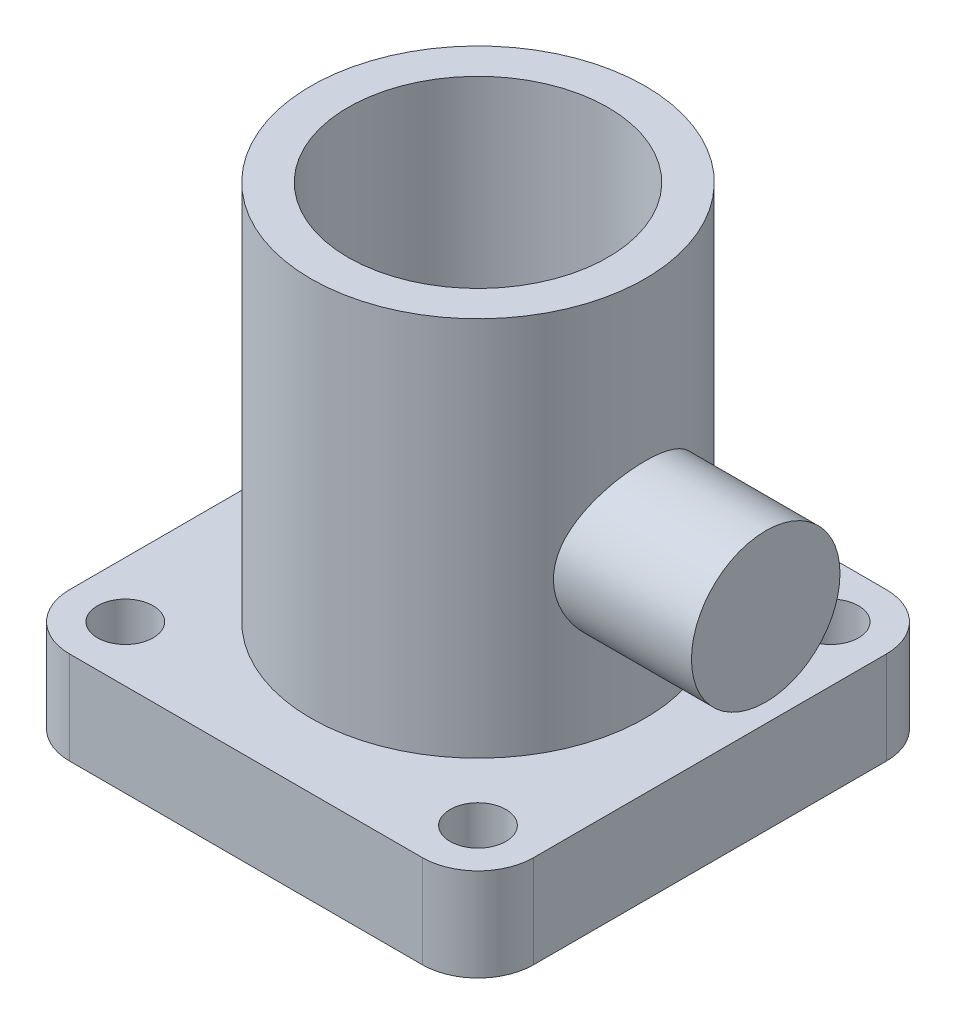
ISO-10303-21;
HEADER;
FILE_DESCRIPTION(('STEP AP214'),'2;1');
FILE_NAME('part.step','',(''),(''),'','','');
FILE_SCHEMA(('AUTOMOTIVE_DESIGN { 1 0 10303 214 1 1 1 1 }'));
ENDSEC;
DATA;
#1=APPLICATION_CONTEXT('core data for automotive mechanical design processes');
#2=APPLICATION_PROTOCOL_DEFINITION('international standard','automotive_design',2000,#1);
#3=PRODUCT_CONTEXT('',#1,'mechanical');
#4=PRODUCT('Part','Part','',(#3));
#5=PRODUCT_RELATED_PRODUCT_CATEGORY('part','',(#4));
#6=PRODUCT_DEFINITION_FORMATION('','',#4);
#7=PRODUCT_DEFINITION_CONTEXT('part definition',#1,'design');
#8=PRODUCT_DEFINITION('design','',#6,#7);
#9=PRODUCT_DEFINITION_SHAPE('','',#8);
#10=(LENGTH_UNIT() NAMED_UNIT(*) SI_UNIT(.MILLI.,.METRE.));
#11=(NAMED_UNIT(*) PLANE_ANGLE_UNIT() SI_UNIT($,.RADIAN.));
#12=(NAMED_UNIT(*) SI_UNIT($,.STERADIAN.) SOLID_ANGLE_UNIT());
#13=UNCERTAINTY_MEASURE_WITH_UNIT(LENGTH_MEASURE(1.E-05),#10,'distance_accuracy_value','');
#14=(GEOMETRIC_REPRESENTATION_CONTEXT(3) GLOBAL_UNCERTAINTY_ASSIGNED_CONTEXT((#13)) GLOBAL_UNIT_ASSIGNED_CONTEXT((#10,
#11,#12)) REPRESENTATION_CONTEXT('',''));
#15=CARTESIAN_POINT('',(0.,0.,0.));
#16=DIRECTION('',(0.,0.,1.));
#17=DIRECTION('',(1.,0.,0.));
#18=AXIS2_PLACEMENT_3D('',#15,#16,#17);
#19=CARTESIAN_POINT('',(0.,51.,0.));
#20=DIRECTION('',(0.,-1.,0.));
#21=DIRECTION('',(0.,0.,-1.));
#22=AXIS2_PLACEMENT_3D('',#19,#20,#21);
#23=CYLINDRICAL_SURFACE('',#22,18.);
#24=CARTESIAN_POINT('',(0.,51.,0.));
#25=DIRECTION('',(0.,1.,0.));
#26=DIRECTION('',(0.,0.,1.));
#27=AXIS2_PLACEMENT_3D('',#24,#25,#26);
#28=CIRCLE('',#27,18.);
#29=CARTESIAN_POINT('',(0.,51.,18.));
#30=VERTEX_POINT('',#29);
#31=EDGE_CURVE('E170',#30,#30,#28,.T.);
#32=ORIENTED_EDGE('',*,*,#31,.F.);
#33=EDGE_LOOP('',(#32));
#34=FACE_BOUND('',#33,.T.);
#35=CARTESIAN_POINT('',(0.,10.,0.));
#36=DIRECTION('',(0.,-1.,0.));
#37=DIRECTION('',(0.,0.,-1.));
#38=AXIS2_PLACEMENT_3D('',#35,#36,#37);
#39=CIRCLE('',#38,18.);
#40=CARTESIAN_POINT('',(0.,10.,-18.));
#41=VERTEX_POINT('',#40);
#42=EDGE_CURVE('E50',#41,#41,#39,.F.);
#43=ORIENTED_EDGE('',*,*,#42,.T.);
#44=EDGE_LOOP('',(#43));
#45=FACE_BOUND('',#44,.T.);
#46=CARTESIAN_POINT('',(16.1245154965971,26.,8.));
#47=CARTESIAN_POINT('',(16.1245173844685,25.7880854300968,7.99999831723584));
#48=CARTESIAN_POINT('',(16.1287075710206,25.5761129175397,7.99156779414506));
#49=CARTESIAN_POINT('',(16.1453266061845,25.1537366565836,7.95793746262861));
#50=CARTESIAN_POINT('',(16.1577603573088,24.9433339170834,7.93272767540808));
#51=CARTESIAN_POINT('',(16.1904617266022,24.5253675723789,7.86576997483584));
#52=CARTESIAN_POINT('',(16.2107447194581,24.3178103722148,7.82398959985824));
#53=CARTESIAN_POINT('',(16.2584620085057,23.9073537972193,7.72434196550041));
#54=CARTESIAN_POINT('',(16.2858993425086,23.7044564409249,7.66646787185647));
#55=CARTESIAN_POINT('',(16.3468833814742,23.3057029649651,7.53555475293443));
#56=CARTESIAN_POINT('',(16.3803993264153,23.1098170839798,7.46259183317014));
#57=CARTESIAN_POINT('',(16.4526380017907,22.7250924703705,7.30194878977129));
#58=CARTESIAN_POINT('',(16.491362725522,22.5362564711155,7.21426302879007));
#59=CARTESIAN_POINT('',(16.5728994701461,22.166796595661,7.02492815140359));
#60=CARTESIAN_POINT('',(16.6157090671748,21.98616794221,6.92328730008513));
#61=CARTESIAN_POINT('',(16.7043290743674,21.6337997331962,6.70664513728595));
#62=CARTESIAN_POINT('',(16.7501405774116,21.4620634562034,6.59163894807261));
#63=CARTESIAN_POINT('',(16.8466296186917,21.117582292585,6.34115277263391));
#64=CARTESIAN_POINT('',(16.8974306119768,20.9454830833526,6.20483168139262));
#65=CARTESIAN_POINT('',(16.9997880262405,20.6131840799974,5.91864012310987));
#66=CARTESIAN_POINT('',(17.0513444742763,20.4529847133313,5.76876916976921));
#67=CARTESIAN_POINT('',(17.1539222783134,20.1452490365932,5.45619080306819));
#68=CARTESIAN_POINT('',(17.2049433056521,19.9977201458417,5.2934759744243));
#69=CARTESIAN_POINT('',(17.3051194894044,19.7163352783986,4.95618577055871));
#70=CARTESIAN_POINT('',(17.3542752786211,19.5824746380617,4.78161447487839));
#71=CARTESIAN_POINT('',(17.451944420544,19.3227567049135,4.41225085697341));
#72=CARTESIAN_POINT('',(17.5002965309104,19.1976581423861,4.21688105837181));
#73=CARTESIAN_POINT('',(17.592223783187,18.9645319877898,3.81524307030924));
#74=CARTESIAN_POINT('',(17.6358009081066,18.8564973009519,3.60897945809888));
#75=CARTESIAN_POINT('',(17.7169432898632,18.6584579183544,3.18686322089285));
#76=CARTESIAN_POINT('',(17.7545095070744,18.5684503417893,2.97101213476108));
#77=CARTESIAN_POINT('',(17.8225194812956,18.4074027061156,2.53126088316878));
#78=CARTESIAN_POINT('',(17.852963815067,18.3363611109926,2.30736137120063));
#79=CARTESIAN_POINT('',(17.904257876405,18.217638959504,1.86651849716053));
#80=CARTESIAN_POINT('',(17.9255631028507,18.1688388892102,1.64992936801691));
#81=CARTESIAN_POINT('',(17.9604311199582,18.0893511335618,1.21283479296799));
#82=CARTESIAN_POINT('',(17.9739941859878,18.0586628040196,0.992329486638335));
#83=CARTESIAN_POINT('',(17.9929834790412,18.0157765357964,0.549266332095986));
#84=CARTESIAN_POINT('',(17.9984129168231,18.0035713008738,0.326709328719164));
#85=CARTESIAN_POINT('',(18.000986079252,17.9977810038239,-0.118690285937497));
#86=CARTESIAN_POINT('',(17.9981301795248,18.0041950975668,-0.341532883811736));
#87=CARTESIAN_POINT('',(17.9847020933519,18.0344697291131,-0.770229836855616));
#88=CARTESIAN_POINT('',(17.9746788214889,18.0570893839132,-0.976190488290874));
#89=CARTESIAN_POINT('',(17.9477796781798,18.1181507550077,-1.3853715673678));
#90=CARTESIAN_POINT('',(17.9309014453193,18.1565979236665,-1.58859102576598));
#91=CARTESIAN_POINT('',(17.8907148831089,18.2489095751061,-1.99076696624121));
#92=CARTESIAN_POINT('',(17.8674087504012,18.3027687912776,-2.18972487965374));
#93=CARTESIAN_POINT('',(17.814913874302,18.425422282077,-2.58226130183552));
#94=CARTESIAN_POINT('',(17.7857228880376,18.4942222517949,-2.77583772747246));
#95=CARTESIAN_POINT('',(17.7216726940735,18.6472737173456,-3.15921637846952));
#96=CARTESIAN_POINT('',(17.6867358849264,18.7317391211582,-3.34892013533131));
#97=CARTESIAN_POINT('',(17.612310171007,18.9147716703667,-3.72054572501928));
#98=CARTESIAN_POINT('',(17.5728196098477,19.0133439501771,-3.90246469299827));
#99=CARTESIAN_POINT('',(17.4901925625269,19.2238502823383,-4.25750941286914));
#100=CARTESIAN_POINT('',(17.447056279086,19.3357835918909,-4.43063565282522));
#101=CARTESIAN_POINT('',(17.3580761944569,19.5723392890387,-4.76733985854246));
#102=CARTESIAN_POINT('',(17.3122314231476,19.6969662349307,-4.93091436085488));
#103=CARTESIAN_POINT('',(17.2151845254857,19.9684262037271,-5.26014620577745));
#104=CARTESIAN_POINT('',(17.1638442956857,20.1162343378699,-5.4249598087832));
#105=CARTESIAN_POINT('',(17.0605056347139,20.424877052991,-5.74168121901704));
#106=CARTESIAN_POINT('',(17.0085071780705,20.5857121393844,-5.89358852504236));
#107=CARTESIAN_POINT('',(16.9051693940131,20.9196483470674,-6.18376803613575));
#108=CARTESIAN_POINT('',(16.8538305336574,21.0927576491085,-6.32203099763521));
#109=CARTESIAN_POINT('',(16.753252225237,21.4501808850419,-6.58393616631743));
#110=CARTESIAN_POINT('',(16.7040120270665,21.6344907574985,-6.70758362588862));
#111=CARTESIAN_POINT('',(16.6070020506593,22.0214264355644,-6.94438947774858));
#112=CARTESIAN_POINT('',(16.5593822210479,22.2244970489115,-7.05688426159653));
#113=CARTESIAN_POINT('',(16.4695129333972,22.6405246655019,-7.26415218409368));
#114=CARTESIAN_POINT('',(16.4272611000893,22.8534772387568,-7.3589331696747));
#115=CARTESIAN_POINT('',(16.3496213055803,23.2878522416804,-7.52985387823975));
#116=CARTESIAN_POINT('',(16.3142303541259,23.5092709308633,-7.60600172612036));
#117=CARTESIAN_POINT('',(16.2516495386502,23.9590038800857,-7.73881716542491));
#118=CARTESIAN_POINT('',(16.2244588203143,24.1873174190791,-7.79548678621097));
#119=CARTESIAN_POINT('',(16.1809822825699,24.6326078032911,-7.88531040967217));
#120=CARTESIAN_POINT('',(16.1640613735819,24.8492448533888,-7.91984376057651));
#121=CARTESIAN_POINT('',(16.1388886731971,25.2851234250266,-7.97101582222543));
#122=CARTESIAN_POINT('',(16.130636464286,25.5043648206181,-7.98765539479638));
#123=CARTESIAN_POINT('',(16.1231199685624,25.9435445757133,-8.00281664233786));
#124=CARTESIAN_POINT('',(16.1238523193879,26.1634826436909,-8.00134509517347));
#125=CARTESIAN_POINT('',(16.134268851521,26.6022728407612,-7.98031997885346));
#126=CARTESIAN_POINT('',(16.1439526799922,26.8211250123144,-7.96076712240067));
#127=CARTESIAN_POINT('',(16.1708129564299,27.2390586874689,-7.90605141179141));
#128=CARTESIAN_POINT('',(16.1873501344573,27.4383572623805,-7.87221665979632));
#129=CARTESIAN_POINT('',(16.2272043533718,27.8332390820918,-7.78973268777251));
#130=CARTESIAN_POINT('',(16.2505237032065,28.0288210373941,-7.74107842226681));
#131=CARTESIAN_POINT('',(16.3032361956667,28.4149705369608,-7.62943609248794));
#132=CARTESIAN_POINT('',(16.3326282043979,28.6055390098707,-7.56645070391758));
#133=CARTESIAN_POINT('',(16.396652000303,28.9806746238518,-7.42668830283406));
#134=CARTESIAN_POINT('',(16.4312858447315,29.1652393739465,-7.34990587319376));
#135=CARTESIAN_POINT('',(16.5449440183094,29.7245108291593,-7.09233057162595));
#136=CARTESIAN_POINT('',(16.6312839817267,30.0877265020214,-6.88923170163484));
#137=CARTESIAN_POINT('',(16.8138795280454,30.7767510681996,-6.43071715646188));
#138=CARTESIAN_POINT('',(16.9101397650623,31.1025422507831,-6.17527686915352));
#139=CARTESIAN_POINT('',(17.0597302595375,31.5730881717547,-5.74384979288594));
#140=CARTESIAN_POINT('',(17.1128010645076,31.7331174995917,-5.58412874072952));
#141=CARTESIAN_POINT('',(17.2177753192135,32.0392431318755,-5.25153114631176));
#142=CARTESIAN_POINT('',(17.2696791438604,32.1853439613994,-5.07865890963663));
#143=CARTESIAN_POINT('',(17.3709727481302,32.4627690794283,-4.72058782341959));
#144=CARTESIAN_POINT('',(17.4203610743079,32.5940848770709,-4.53538198701896));
#145=CARTESIAN_POINT('',(17.5152557653374,32.8408443734614,-4.15384559946254));
#146=CARTESIAN_POINT('',(17.5607638077543,32.9562949445713,-3.9575199174804));
#147=CARTESIAN_POINT('',(17.6470640049451,33.1713779039351,-3.55306354214972));
#148=CARTESIAN_POINT('',(17.6878108023972,33.2708610731676,-3.34484366457995));
#149=CARTESIAN_POINT('',(17.7629557505932,33.4518034001761,-2.91959172938723));
#150=CARTESIAN_POINT('',(17.7973537914545,33.5332622459969,-2.7025595193221));
#151=CARTESIAN_POINT('',(17.8587679278129,33.6772280802444,-2.26140906177526));
#152=CARTESIAN_POINT('',(17.8857881728829,33.7397457241526,-2.03729487695819));
#153=CARTESIAN_POINT('',(17.9316455780454,33.8451367104649,-1.58367729933313));
#154=CARTESIAN_POINT('',(17.9504834603661,33.8880117866675,-1.35417438405501));
#155=CARTESIAN_POINT('',(17.9782671297193,33.9510262334482,-0.909716399150562));
#156=CARTESIAN_POINT('',(17.9878671551004,33.9726718243528,-0.695014576236329));
#157=CARTESIAN_POINT('',(17.9993471860939,33.9985396525114,-0.264362285110347));
#158=CARTESIAN_POINT('',(18.0012276120922,34.0027628385366,-0.0484118855336523));
#159=CARTESIAN_POINT('',(17.997217448135,33.9937382399545,0.383006037482063));
#160=CARTESIAN_POINT('',(17.9913283745967,33.9804938645901,0.598473646928929));
#161=CARTESIAN_POINT('',(17.971942933447,33.936694429073,1.02729288739305));
#162=CARTESIAN_POINT('',(17.9584466541185,33.9061395698116,1.24064454293711));
#163=CARTESIAN_POINT('',(17.9249777004703,33.8298111923434,1.65416895049554));
#164=CARTESIAN_POINT('',(17.9053211453748,33.7847781995449,1.85450476600019));
#165=CARTESIAN_POINT('',(17.8598656381032,33.6796514910869,2.25054265745566));
#166=CARTESIAN_POINT('',(17.8340645509163,33.6195525401492,2.44624309673058));
#167=CARTESIAN_POINT('',(17.7769360415322,33.4848628139897,2.83169559318191));
#168=CARTESIAN_POINT('',(17.7456100149699,33.4102756980897,3.02144913835908));
#169=CARTESIAN_POINT('',(17.678127350379,33.2471855052703,3.39406573427307));
#170=CARTESIAN_POINT('',(17.6419688702804,33.1586771194523,3.57692612317894));
#171=CARTESIAN_POINT('',(17.5638914957692,32.9640924327411,3.94287872867608));
#172=CARTESIAN_POINT('',(17.5217854585831,32.857400407374,4.12560358359436));
#173=CARTESIAN_POINT('',(17.4341502103175,32.6302768755128,4.48151913664302));
#174=CARTESIAN_POINT('',(17.3886198254664,32.5098406505018,4.65470653003519));
#175=CARTESIAN_POINT('',(17.2951906704745,32.2560009002268,4.99067005689802));
#176=CARTESIAN_POINT('',(17.2472914674081,32.1225950002878,5.15344427469432));
#177=CARTESIAN_POINT('',(17.1502306027945,31.8435875392346,5.46778331119965));
#178=CARTESIAN_POINT('',(17.1010688746332,31.6979853336911,5.6193475367965));
#179=CARTESIAN_POINT('',(16.9987278379694,31.3833622114151,5.92205669373057));
#180=CARTESIAN_POINT('',(16.9455381412313,31.2133999001185,6.07222140456485));
#181=CARTESIAN_POINT('',(16.8405029326141,30.8611507820629,6.35771940607388));
#182=CARTESIAN_POINT('',(16.7886570027711,30.6788678727102,6.49305735176128));
#183=CARTESIAN_POINT('',(16.6877339704444,30.3027106417247,6.74821326098058));
#184=CARTESIAN_POINT('',(16.63865988301,30.108824153029,6.86801450136303));
#185=CARTESIAN_POINT('',(16.5448700115573,29.7108085926706,7.09097341812933));
#186=CARTESIAN_POINT('',(16.5001522654361,29.5066841955217,7.19413860126822));
#187=CARTESIAN_POINT('',(16.4163378623127,29.0884142140267,7.38340158764196));
#188=CARTESIAN_POINT('',(16.3772670113222,28.8742282048892,7.46942167707747));
#189=CARTESIAN_POINT('',(16.3064029483656,28.4382365761269,7.62288490526618));
#190=CARTESIAN_POINT('',(16.2746060925309,28.2164348358901,7.69033734883932));
#191=CARTESIAN_POINT('',(16.219563234548,27.7674126270442,7.80575763461412));
#192=CARTESIAN_POINT('',(16.1962948027815,27.5402080702789,7.85377662169272));
#193=CARTESIAN_POINT('',(16.1591558445265,27.0818496459529,7.92991158533124));
#194=CARTESIAN_POINT('',(16.1452782569039,26.8506988799983,7.95804251676984));
#195=CARTESIAN_POINT('',(16.132434322231,26.5157915044309,7.98402286016531));
#196=CARTESIAN_POINT('',(16.1294677679271,26.4127538769094,7.99001178153472));
#197=CARTESIAN_POINT('',(16.1255078681798,26.2064820879059,7.99800081602834));
#198=CARTESIAN_POINT('',(16.1245145767981,26.103247921117,8.00000081986765));
#199=CARTESIAN_POINT('',(16.1245154965971,26.,8.));
#200=B_SPLINE_CURVE_WITH_KNOTS('',3,(#46,#47,#48,#49,#50,#51,#52,#53,#54,#55,#56,#57,#58,#59,
#60,#61,#62,#63,#64,#65,#66,#67,#68,#69,#70,#71,#72,#73,#74,#75,#76,#77,#78,#79,#80,#81,#82,#83,
#84,#85,#86,#87,#88,#89,#90,#91,#92,#93,#94,#95,#96,#97,#98,#99,#100,#101,#102,#103,#104,#105,
#106,#107,#108,#109,#110,#111,#112,#113,#114,#115,#116,#117,#118,#119,#120,#121,#122,#123,#124,
#125,#126,#127,#128,#129,#130,#131,#132,#133,#134,#135,#136,#137,#138,#139,#140,#141,#142,#143,
#144,#145,#146,#147,#148,#149,#150,#151,#152,#153,#154,#155,#156,#157,#158,#159,#160,#161,#162,
#163,#164,#165,#166,#167,#168,#169,#170,#171,#172,#173,#174,#175,#176,#177,#178,#179,#180,#181,
#182,#183,#184,#185,#186,#187,#188,#189,#190,#191,#192,#193,#194,#195,#196,#197,#198,#199),
.UNSPECIFIED.,.T.,.F.,(4,2,2,2,2,2,2,2,2,2,2,2,2,2,2,2,2,2,2,2,2,2,2,2,2,2,2,2,2,2,2,2,2,2,2,2,
2,2,2,2,2,2,2,2,2,2,2,2,2,2,2,2,2,2,2,2,2,2,2,2,2,2,2,2,2,2,2,2,2,2,2,2,2,2,2,2,4),(0.,
0.635636786928927,1.27165193153097,1.90891922718068,2.54645755535102,3.18085542165325,
3.8154967539086,4.44976381995587,5.08426309551977,5.75957539492705,6.43491194065524,
7.11064127777359,7.78613927824711,8.49616211017143,9.20588894929658,9.91550228053243,
10.6250581242452,11.2932925940023,11.9615032949632,12.6294501494797,13.2973667222889,
13.9189587631528,14.5407651134849,15.1623592331946,15.7841907082495,16.4152389805999,
17.0465175195699,17.6777609793301,18.3092319238108,18.9902534133529,19.6713013375874,
20.3528075255057,21.0340680503806,21.7441029457321,22.4538225574607,23.1632321454316,
23.8725678003063,24.5317508363103,25.1909021223531,25.8498067365912,26.5086853801897,
27.1164695431674,27.7244608651212,28.332338764623,28.9404558585894,30.2098823122136,
31.4799070545452,32.1759540258526,32.8717740899456,33.5679917384279,34.2639068482617,
34.9659880424643,35.6680813869599,36.3697790283171,37.0714147207057,37.718598553561,
38.3657471422866,39.0127694420453,39.6597842331429,40.2779063013467,40.8962434595929,
41.514424645059,42.1328421490507,42.7793728810372,43.4261262448349,44.0729982493804,
44.7199044549849,45.4179476734238,46.1157711022534,46.8143395168877,47.5125918262566,
48.2139405270059,48.9149371177799,49.6140766404868,50.3126898825115,50.6223730671827,
50.9320647361693),.UNSPECIFIED.);
#201=CARTESIAN_POINT('',(16.1245154965971,26.,8.));
#202=VERTEX_POINT('',#201);
#203=EDGE_CURVE('E11',#202,#202,#200,.T.);
#204=ORIENTED_EDGE('',*,*,#203,.F.);
#205=EDGE_LOOP('',(#204));
#206=FACE_BOUND('',#205,.T.);
#207=ADVANCED_FACE('F37',(#34,#45,#206),#23,.T.);
#208=CARTESIAN_POINT('',(19.,10.,-19.));
#209=DIRECTION('',(0.,-1.,0.));
#210=DIRECTION('',(0.,0.,-1.));
#211=AXIS2_PLACEMENT_3D('',#208,#209,#210);
#212=CYLINDRICAL_SURFACE('',#211,6.);
#213=DIRECTION('',(0.,-1.,0.));
#214=VECTOR('',#213,1.);
#215=CARTESIAN_POINT('',(19.,10.,-25.));
#216=LINE('',#215,#214);
#217=CARTESIAN_POINT('',(19.,10.,-25.));
#218=VERTEX_POINT('',#217);
#219=CARTESIAN_POINT('',(19.,0.,-25.));
#220=VERTEX_POINT('',#219);
#221=EDGE_CURVE('E114',#218,#220,#216,.T.);
#222=ORIENTED_EDGE('',*,*,#221,.F.);
#223=CARTESIAN_POINT('',(19.,10.,-19.));
#224=DIRECTION('',(0.,-1.,0.));
#225=DIRECTION('',(0.,0.,-1.));
#226=AXIS2_PLACEMENT_3D('',#223,#224,#225);
#227=CIRCLE('',#226,6.);
#228=CARTESIAN_POINT('',(25.,10.,-19.));
#229=VERTEX_POINT('',#228);
#230=EDGE_CURVE('E64',#229,#218,#227,.F.);
#231=ORIENTED_EDGE('',*,*,#230,.F.);
#232=DIRECTION('',(0.,-1.,0.));
#233=VECTOR('',#232,1.);
#234=CARTESIAN_POINT('',(25.,10.,-19.));
#235=LINE('',#234,#233);
#236=CARTESIAN_POINT('',(25.,0.,-19.));
#237=VERTEX_POINT('',#236);
#238=EDGE_CURVE('E162',#237,#229,#235,.F.);
#239=ORIENTED_EDGE('',*,*,#238,.F.);
#240=CARTESIAN_POINT('',(19.,0.,-19.));
#241=DIRECTION('',(0.,-1.,0.));
#242=DIRECTION('',(0.,0.,-1.));
#243=AXIS2_PLACEMENT_3D('',#240,#241,#242);
#244=CIRCLE('',#243,6.);
#245=EDGE_CURVE('E57',#220,#237,#244,.T.);
#246=ORIENTED_EDGE('',*,*,#245,.F.);
#247=EDGE_LOOP('',(#222,#231,#239,#246));
#248=FACE_BOUND('',#247,.T.);
#249=ADVANCED_FACE('F39',(#248),#212,.T.);
#250=CARTESIAN_POINT('',(19.,10.,19.));
#251=DIRECTION('',(0.,-1.,0.));
#252=DIRECTION('',(0.,0.,-1.));
#253=AXIS2_PLACEMENT_3D('',#250,#251,#252);
#254=CYLINDRICAL_SURFACE('',#253,6.);
#255=DIRECTION('',(0.,-1.,0.));
#256=VECTOR('',#255,1.);
#257=CARTESIAN_POINT('',(25.,10.,19.));
#258=LINE('',#257,#256);
#259=CARTESIAN_POINT('',(25.,10.,19.));
#260=VERTEX_POINT('',#259);
#261=CARTESIAN_POINT('',(25.,0.,19.));
#262=VERTEX_POINT('',#261);
#263=EDGE_CURVE('E151',#260,#262,#258,.T.);
#264=ORIENTED_EDGE('',*,*,#263,.F.);
#265=CARTESIAN_POINT('',(19.,10.,19.));
#266=DIRECTION('',(0.,-1.,0.));
#267=DIRECTION('',(0.,0.,-1.));
#268=AXIS2_PLACEMENT_3D('',#265,#266,#267);
#269=CIRCLE('',#268,6.);
#270=CARTESIAN_POINT('',(19.,10.,25.));
#271=VERTEX_POINT('',#270);
#272=EDGE_CURVE('E157',#271,#260,#269,.F.);
#273=ORIENTED_EDGE('',*,*,#272,.F.);
#274=DIRECTION('',(0.,-1.,0.));
#275=VECTOR('',#274,1.);
#276=CARTESIAN_POINT('',(19.,10.,25.));
#277=LINE('',#276,#275);
#278=CARTESIAN_POINT('',(19.,0.,25.));
#279=VERTEX_POINT('',#278);
#280=EDGE_CURVE('E154',#279,#271,#277,.F.);
#281=ORIENTED_EDGE('',*,*,#280,.F.);
#282=CARTESIAN_POINT('',(19.,0.,19.));
#283=DIRECTION('',(0.,-1.,0.));
#284=DIRECTION('',(0.,0.,-1.));
#285=AXIS2_PLACEMENT_3D('',#282,#283,#284);
#286=CIRCLE('',#285,6.);
#287=EDGE_CURVE('E159',#262,#279,#286,.T.);
#288=ORIENTED_EDGE('',*,*,#287,.F.);
#289=EDGE_LOOP('',(#264,#273,#281,#288));
#290=FACE_BOUND('',#289,.T.);
#291=ADVANCED_FACE('F215',(#290),#254,.T.);
#292=CARTESIAN_POINT('',(-19.,10.,19.));
#293=DIRECTION('',(0.,-1.,0.));
#294=DIRECTION('',(0.,0.,-1.));
#295=AXIS2_PLACEMENT_3D('',#292,#293,#294);
#296=CYLINDRICAL_SURFACE('',#295,6.);
#297=DIRECTION('',(0.,-1.,0.));
#298=VECTOR('',#297,1.);
#299=CARTESIAN_POINT('',(-19.,10.,25.));
#300=LINE('',#299,#298);
#301=CARTESIAN_POINT('',(-19.,10.,25.));
#302=VERTEX_POINT('',#301);
#303=CARTESIAN_POINT('',(-19.,0.,25.));
#304=VERTEX_POINT('',#303);
#305=EDGE_CURVE('E141',#302,#304,#300,.T.);
#306=ORIENTED_EDGE('',*,*,#305,.F.);
#307=CARTESIAN_POINT('',(-19.,10.,19.));
#308=DIRECTION('',(0.,-1.,0.));
#309=DIRECTION('',(0.,0.,-1.));
#310=AXIS2_PLACEMENT_3D('',#307,#308,#309);
#311=CIRCLE('',#310,6.);
#312=CARTESIAN_POINT('',(-25.,10.,19.));
#313=VERTEX_POINT('',#312);
#314=EDGE_CURVE('E147',#313,#302,#311,.F.);
#315=ORIENTED_EDGE('',*,*,#314,.F.);
#316=DIRECTION('',(0.,-1.,0.));
#317=VECTOR('',#316,1.);
#318=CARTESIAN_POINT('',(-25.,10.,19.));
#319=LINE('',#318,#317);
#320=CARTESIAN_POINT('',(-25.,0.,19.));
#321=VERTEX_POINT('',#320);
#322=EDGE_CURVE('E144',#321,#313,#319,.F.);
#323=ORIENTED_EDGE('',*,*,#322,.F.);
#324=CARTESIAN_POINT('',(-19.,0.,19.));
#325=DIRECTION('',(0.,-1.,0.));
#326=DIRECTION('',(0.,0.,-1.));
#327=AXIS2_PLACEMENT_3D('',#324,#325,#326);
#328=CIRCLE('',#327,6.);
#329=EDGE_CURVE('E149',#304,#321,#328,.T.);
#330=ORIENTED_EDGE('',*,*,#329,.F.);
#331=EDGE_LOOP('',(#306,#315,#323,#330));
#332=FACE_BOUND('',#331,.T.);
#333=ADVANCED_FACE('F221',(#332),#296,.T.);
#334=CARTESIAN_POINT('',(-19.,10.,-19.));
#335=DIRECTION('',(0.,1.,0.));
#336=DIRECTION('',(0.,0.,1.));
#337=AXIS2_PLACEMENT_3D('',#334,#335,#336);
#338=CYLINDRICAL_SURFACE('',#337,6.);
#339=DIRECTION('',(0.,1.,0.));
#340=VECTOR('',#339,1.);
#341=CARTESIAN_POINT('',(-19.,10.,-25.));
#342=LINE('',#341,#340);
#343=CARTESIAN_POINT('',(-19.,0.,-25.));
#344=VERTEX_POINT('',#343);
#345=CARTESIAN_POINT('',(-19.,10.,-25.));
#346=VERTEX_POINT('',#345);
#347=EDGE_CURVE('E113',#344,#346,#342,.T.);
#348=ORIENTED_EDGE('',*,*,#347,.F.);
#349=CARTESIAN_POINT('',(-19.,0.,-19.));
#350=DIRECTION('',(0.,-1.,0.));
#351=DIRECTION('',(0.,0.,-1.));
#352=AXIS2_PLACEMENT_3D('',#349,#350,#351);
#353=CIRCLE('',#352,6.);
#354=CARTESIAN_POINT('',(-25.,0.,-19.));
#355=VERTEX_POINT('',#354);
#356=EDGE_CURVE('E119',#355,#344,#353,.T.);
#357=ORIENTED_EDGE('',*,*,#356,.F.);
#358=DIRECTION('',(0.,1.,0.));
#359=VECTOR('',#358,1.);
#360=CARTESIAN_POINT('',(-25.,10.,-19.));
#361=LINE('',#360,#359);
#362=CARTESIAN_POINT('',(-25.,10.,-19.));
#363=VERTEX_POINT('',#362);
#364=EDGE_CURVE('E126',#363,#355,#361,.F.);
#365=ORIENTED_EDGE('',*,*,#364,.F.);
#366=CARTESIAN_POINT('',(-19.,10.,-19.));
#367=DIRECTION('',(0.,-1.,0.));
#368=DIRECTION('',(0.,0.,-1.));
#369=AXIS2_PLACEMENT_3D('',#366,#367,#368);
#370=CIRCLE('',#369,6.);
#371=EDGE_CURVE('E125',#346,#363,#370,.F.);
#372=ORIENTED_EDGE('',*,*,#371,.F.);
#373=EDGE_LOOP('',(#348,#357,#365,#372));
#374=FACE_BOUND('',#373,.T.);
#375=ADVANCED_FACE('F129',(#374),#338,.T.);
#376=CARTESIAN_POINT('',(25.,10.,25.));
#377=DIRECTION('',(-1.,0.,0.));
#378=DIRECTION('',(0.,0.,1.));
#379=AXIS2_PLACEMENT_3D('',#376,#377,#378);
#380=PLANE('',#379);
#381=DIRECTION('',(0.,0.,-1.));
#382=VECTOR('',#381,1.);
#383=CARTESIAN_POINT('',(25.,0.,25.));
#384=LINE('',#383,#382);
#385=EDGE_CURVE('E116',#262,#237,#384,.T.);
#386=ORIENTED_EDGE('',*,*,#385,.T.);
#387=ORIENTED_EDGE('',*,*,#238,.T.);
#388=DIRECTION('',(0.,0.,-1.));
#389=VECTOR('',#388,1.);
#390=CARTESIAN_POINT('',(25.,10.,25.));
#391=LINE('',#390,#389);
#392=EDGE_CURVE('E196',#260,#229,#391,.T.);
#393=ORIENTED_EDGE('',*,*,#392,.F.);
#394=ORIENTED_EDGE('',*,*,#263,.T.);
#395=EDGE_LOOP('',(#386,#387,#393,#394));
#396=FACE_BOUND('',#395,.T.);
#397=ADVANCED_FACE('F230',(#396),#380,.F.);
#398=CARTESIAN_POINT('',(-25.,10.,-25.));
#399=DIRECTION('',(0.,0.,1.));
#400=DIRECTION('',(1.,0.,0.));
#401=AXIS2_PLACEMENT_3D('',#398,#399,#400);
#402=PLANE('',#401);
#403=DIRECTION('',(-1.,0.,0.));
#404=VECTOR('',#403,1.);
#405=CARTESIAN_POINT('',(-25.,10.,-25.));
#406=LINE('',#405,#404);
#407=EDGE_CURVE('E199',#218,#346,#406,.T.);
#408=ORIENTED_EDGE('',*,*,#407,.F.);
#409=ORIENTED_EDGE('',*,*,#221,.T.);
#410=DIRECTION('',(-1.,0.,0.));
#411=VECTOR('',#410,1.);
#412=CARTESIAN_POINT('',(-25.,0.,-25.));
#413=LINE('',#412,#411);
#414=EDGE_CURVE('E108',#220,#344,#413,.T.);
#415=ORIENTED_EDGE('',*,*,#414,.T.);
#416=ORIENTED_EDGE('',*,*,#347,.T.);
#417=EDGE_LOOP('',(#408,#409,#415,#416));
#418=FACE_BOUND('',#417,.T.);
#419=ADVANCED_FACE('F111',(#418),#402,.F.);
#420=CARTESIAN_POINT('',(-25.,10.,25.));
#421=DIRECTION('',(1.,0.,0.));
#422=DIRECTION('',(0.,0.,-1.));
#423=AXIS2_PLACEMENT_3D('',#420,#421,#422);
#424=PLANE('',#423);
#425=DIRECTION('',(0.,0.,1.));
#426=VECTOR('',#425,1.);
#427=CARTESIAN_POINT('',(-25.,0.,25.));
#428=LINE('',#427,#426);
#429=EDGE_CURVE('E115',#355,#321,#428,.T.);
#430=ORIENTED_EDGE('',*,*,#429,.T.);
#431=ORIENTED_EDGE('',*,*,#322,.T.);
#432=DIRECTION('',(0.,0.,1.));
#433=VECTOR('',#432,1.);
#434=CARTESIAN_POINT('',(-25.,10.,25.));
#435=LINE('',#434,#433);
#436=EDGE_CURVE('E134',#363,#313,#435,.T.);
#437=ORIENTED_EDGE('',*,*,#436,.F.);
#438=ORIENTED_EDGE('',*,*,#364,.T.);
#439=EDGE_LOOP('',(#430,#431,#437,#438));
#440=FACE_BOUND('',#439,.T.);
#441=ADVANCED_FACE('F222',(#440),#424,.F.);
#442=CARTESIAN_POINT('',(-25.,10.,25.));
#443=DIRECTION('',(0.,0.,-1.));
#444=DIRECTION('',(-1.,0.,0.));
#445=AXIS2_PLACEMENT_3D('',#442,#443,#444);
#446=PLANE('',#445);
#447=DIRECTION('',(1.,0.,0.));
#448=VECTOR('',#447,1.);
#449=CARTESIAN_POINT('',(-25.,0.,25.));
#450=LINE('',#449,#448);
#451=EDGE_CURVE('E137',#304,#279,#450,.T.);
#452=ORIENTED_EDGE('',*,*,#451,.T.);
#453=ORIENTED_EDGE('',*,*,#280,.T.);
#454=DIRECTION('',(1.,0.,0.));
#455=VECTOR('',#454,1.);
#456=CARTESIAN_POINT('',(-25.,10.,25.));
#457=LINE('',#456,#455);
#458=EDGE_CURVE('E130',#302,#271,#457,.T.);
#459=ORIENTED_EDGE('',*,*,#458,.F.);
#460=ORIENTED_EDGE('',*,*,#305,.T.);
#461=EDGE_LOOP('',(#452,#453,#459,#460));
#462=FACE_BOUND('',#461,.T.);
#463=ADVANCED_FACE('F208',(#462),#446,.F.);
#464=CARTESIAN_POINT('',(0.,10.,0.));
#465=DIRECTION('',(0.,-1.,0.));
#466=DIRECTION('',(0.,0.,-1.));
#467=AXIS2_PLACEMENT_3D('',#464,#465,#466);
#468=PLANE('',#467);
#469=ORIENTED_EDGE('',*,*,#42,.F.);
#470=EDGE_LOOP('',(#469));
#471=FACE_BOUND('',#470,.T.);
#472=CARTESIAN_POINT('',(19.,10.,19.));
#473=DIRECTION('',(0.,1.,0.));
#474=DIRECTION('',(0.,0.,1.));
#475=AXIS2_PLACEMENT_3D('',#472,#473,#474);
#476=CIRCLE('',#475,3.);
#477=CARTESIAN_POINT('',(19.,10.,22.));
#478=VERTEX_POINT('',#477);
#479=EDGE_CURVE('E176',#478,#478,#476,.T.);
#480=ORIENTED_EDGE('',*,*,#479,.F.);
#481=EDGE_LOOP('',(#480));
#482=FACE_BOUND('',#481,.T.);
#483=CARTESIAN_POINT('',(19.,10.,-19.));
#484=DIRECTION('',(0.,1.,0.));
#485=DIRECTION('',(0.,0.,1.));
#486=AXIS2_PLACEMENT_3D('',#483,#484,#485);
#487=CIRCLE('',#486,3.);
#488=CARTESIAN_POINT('',(19.,10.,-16.));
#489=VERTEX_POINT('',#488);
#490=EDGE_CURVE('E175',#489,#489,#487,.T.);
#491=ORIENTED_EDGE('',*,*,#490,.F.);
#492=EDGE_LOOP('',(#491));
#493=FACE_BOUND('',#492,.T.);
#494=CARTESIAN_POINT('',(-19.,10.,-19.));
#495=DIRECTION('',(0.,1.,0.));
#496=DIRECTION('',(0.,0.,1.));
#497=AXIS2_PLACEMENT_3D('',#494,#495,#496);
#498=CIRCLE('',#497,3.);
#499=CARTESIAN_POINT('',(-19.,10.,-16.));
#500=VERTEX_POINT('',#499);
#501=EDGE_CURVE('E182',#500,#500,#498,.T.);
#502=ORIENTED_EDGE('',*,*,#501,.F.);
#503=EDGE_LOOP('',(#502));
#504=FACE_BOUND('',#503,.T.);
#505=CARTESIAN_POINT('',(-19.,10.,19.));
#506=DIRECTION('',(0.,1.,0.));
#507=DIRECTION('',(0.,0.,1.));
#508=AXIS2_PLACEMENT_3D('',#505,#506,#507);
#509=CIRCLE('',#508,3.);
#510=CARTESIAN_POINT('',(-19.,10.,22.));
#511=VERTEX_POINT('',#510);
#512=EDGE_CURVE('E188',#511,#511,#509,.T.);
#513=ORIENTED_EDGE('',*,*,#512,.F.);
#514=EDGE_LOOP('',(#513));
#515=FACE_BOUND('',#514,.T.);
#516=ORIENTED_EDGE('',*,*,#392,.T.);
#517=ORIENTED_EDGE('',*,*,#230,.T.);
#518=ORIENTED_EDGE('',*,*,#407,.T.);
#519=ORIENTED_EDGE('',*,*,#371,.T.);
#520=ORIENTED_EDGE('',*,*,#436,.T.);
#521=ORIENTED_EDGE('',*,*,#314,.T.);
#522=ORIENTED_EDGE('',*,*,#458,.T.);
#523=ORIENTED_EDGE('',*,*,#272,.T.);
#524=EDGE_LOOP('',(#516,#517,#518,#519,#520,#521,#522,#523));
#525=FACE_BOUND('',#524,.T.);
#526=ADVANCED_FACE('F218',(#471,#482,#493,#504,#515,#525),#468,.F.);
#527=CARTESIAN_POINT('',(0.,0.,0.));
#528=DIRECTION('',(0.,-1.,0.));
#529=DIRECTION('',(0.,0.,-1.));
#530=AXIS2_PLACEMENT_3D('',#527,#528,#529);
#531=PLANE('',#530);
#532=CARTESIAN_POINT('',(0.,0.,0.));
#533=DIRECTION('',(0.,1.,0.));
#534=DIRECTION('',(0.,0.,1.));
#535=AXIS2_PLACEMENT_3D('',#532,#533,#534);
#536=CIRCLE('',#535,14.);
#537=CARTESIAN_POINT('',(0.,0.,14.));
#538=VERTEX_POINT('',#537);
#539=EDGE_CURVE('E268',#538,#538,#536,.T.);
#540=ORIENTED_EDGE('',*,*,#539,.T.);
#541=EDGE_LOOP('',(#540));
#542=FACE_BOUND('',#541,.T.);
#543=CARTESIAN_POINT('',(19.,0.,19.));
#544=DIRECTION('',(0.,1.,0.));
#545=DIRECTION('',(0.,0.,1.));
#546=AXIS2_PLACEMENT_3D('',#543,#544,#545);
#547=CIRCLE('',#546,3.);
#548=CARTESIAN_POINT('',(19.,0.,22.));
#549=VERTEX_POINT('',#548);
#550=EDGE_CURVE('E172',#549,#549,#547,.T.);
#551=ORIENTED_EDGE('',*,*,#550,.T.);
#552=EDGE_LOOP('',(#551));
#553=FACE_BOUND('',#552,.T.);
#554=CARTESIAN_POINT('',(19.,0.,-19.));
#555=DIRECTION('',(0.,1.,0.));
#556=DIRECTION('',(0.,0.,1.));
#557=AXIS2_PLACEMENT_3D('',#554,#555,#556);
#558=CIRCLE('',#557,3.);
#559=CARTESIAN_POINT('',(19.,0.,-16.));
#560=VERTEX_POINT('',#559);
#561=EDGE_CURVE('E179',#560,#560,#558,.T.);
#562=ORIENTED_EDGE('',*,*,#561,.T.);
#563=EDGE_LOOP('',(#562));
#564=FACE_BOUND('',#563,.T.);
#565=CARTESIAN_POINT('',(-19.,0.,-19.));
#566=DIRECTION('',(0.,1.,0.));
#567=DIRECTION('',(0.,0.,1.));
#568=AXIS2_PLACEMENT_3D('',#565,#566,#567);
#569=CIRCLE('',#568,3.);
#570=CARTESIAN_POINT('',(-19.,0.,-16.));
#571=VERTEX_POINT('',#570);
#572=EDGE_CURVE('E185',#571,#571,#569,.T.);
#573=ORIENTED_EDGE('',*,*,#572,.T.);
#574=EDGE_LOOP('',(#573));
#575=FACE_BOUND('',#574,.T.);
#576=CARTESIAN_POINT('',(-19.,0.,19.));
#577=DIRECTION('',(0.,1.,0.));
#578=DIRECTION('',(0.,0.,1.));
#579=AXIS2_PLACEMENT_3D('',#576,#577,#578);
#580=CIRCLE('',#579,3.);
#581=CARTESIAN_POINT('',(-19.,0.,22.));
#582=VERTEX_POINT('',#581);
#583=EDGE_CURVE('E191',#582,#582,#580,.T.);
#584=ORIENTED_EDGE('',*,*,#583,.T.);
#585=EDGE_LOOP('',(#584));
#586=FACE_BOUND('',#585,.T.);
#587=ORIENTED_EDGE('',*,*,#414,.F.);
#588=ORIENTED_EDGE('',*,*,#245,.T.);
#589=ORIENTED_EDGE('',*,*,#385,.F.);
#590=ORIENTED_EDGE('',*,*,#287,.T.);
#591=ORIENTED_EDGE('',*,*,#451,.F.);
#592=ORIENTED_EDGE('',*,*,#329,.T.);
#593=ORIENTED_EDGE('',*,*,#429,.F.);
#594=ORIENTED_EDGE('',*,*,#356,.T.);
#595=EDGE_LOOP('',(#587,#588,#589,#590,#591,#592,#593,#594));
#596=FACE_BOUND('',#595,.T.);
#597=ADVANCED_FACE('F120',(#542,#553,#564,#575,#586,#596),#531,.T.);
#598=CARTESIAN_POINT('',(-19.,0.,19.));
#599=DIRECTION('',(0.,1.,0.));
#600=DIRECTION('',(0.,0.,1.));
#601=AXIS2_PLACEMENT_3D('',#598,#599,#600);
#602=CYLINDRICAL_SURFACE('',#601,3.);
#603=ORIENTED_EDGE('',*,*,#583,.F.);
#604=EDGE_LOOP('',(#603));
#605=FACE_BOUND('',#604,.T.);
#606=ORIENTED_EDGE('',*,*,#512,.T.);
#607=EDGE_LOOP('',(#606));
#608=FACE_BOUND('',#607,.T.);
#609=ADVANCED_FACE('F253',(#605,#608),#602,.F.);
#610=CARTESIAN_POINT('',(-19.,0.,-19.));
#611=DIRECTION('',(0.,1.,0.));
#612=DIRECTION('',(0.,0.,1.));
#613=AXIS2_PLACEMENT_3D('',#610,#611,#612);
#614=CYLINDRICAL_SURFACE('',#613,3.);
#615=ORIENTED_EDGE('',*,*,#572,.F.);
#616=EDGE_LOOP('',(#615));
#617=FACE_BOUND('',#616,.T.);
#618=ORIENTED_EDGE('',*,*,#501,.T.);
#619=EDGE_LOOP('',(#618));
#620=FACE_BOUND('',#619,.T.);
#621=ADVANCED_FACE('F249',(#617,#620),#614,.F.);
#622=CARTESIAN_POINT('',(19.,0.,-19.));
#623=DIRECTION('',(0.,1.,0.));
#624=DIRECTION('',(0.,0.,1.));
#625=AXIS2_PLACEMENT_3D('',#622,#623,#624);
#626=CYLINDRICAL_SURFACE('',#625,3.);
#627=ORIENTED_EDGE('',*,*,#561,.F.);
#628=EDGE_LOOP('',(#627));
#629=FACE_BOUND('',#628,.T.);
#630=ORIENTED_EDGE('',*,*,#490,.T.);
#631=EDGE_LOOP('',(#630));
#632=FACE_BOUND('',#631,.T.);
#633=ADVANCED_FACE('F245',(#629,#632),#626,.F.);
#634=CARTESIAN_POINT('',(19.,0.,19.));
#635=DIRECTION('',(0.,1.,0.));
#636=DIRECTION('',(0.,0.,1.));
#637=AXIS2_PLACEMENT_3D('',#634,#635,#636);
#638=CYLINDRICAL_SURFACE('',#637,3.);
#639=ORIENTED_EDGE('',*,*,#550,.F.);
#640=EDGE_LOOP('',(#639));
#641=FACE_BOUND('',#640,.T.);
#642=ORIENTED_EDGE('',*,*,#479,.T.);
#643=EDGE_LOOP('',(#642));
#644=FACE_BOUND('',#643,.T.);
#645=ADVANCED_FACE('F242',(#641,#644),#638,.F.);
#646=CARTESIAN_POINT('',(0.,51.,0.));
#647=DIRECTION('',(0.,1.,0.));
#648=DIRECTION('',(0.,0.,1.));
#649=AXIS2_PLACEMENT_3D('',#646,#647,#648);
#650=PLANE('',#649);
#651=CARTESIAN_POINT('',(0.,51.,0.));
#652=DIRECTION('',(0.,1.,0.));
#653=DIRECTION('',(0.,0.,1.));
#654=AXIS2_PLACEMENT_3D('',#651,#652,#653);
#655=CIRCLE('',#654,14.);
#656=CARTESIAN_POINT('',(0.,51.,14.));
#657=VERTEX_POINT('',#656);
#658=EDGE_CURVE('E290',#657,#657,#655,.T.);
#659=ORIENTED_EDGE('',*,*,#658,.F.);
#660=EDGE_LOOP('',(#659));
#661=FACE_BOUND('',#660,.T.);
#662=ORIENTED_EDGE('',*,*,#31,.T.);
#663=EDGE_LOOP('',(#662));
#664=FACE_BOUND('',#663,.T.);
#665=ADVANCED_FACE('F241',(#661,#664),#650,.T.);
#666=CARTESIAN_POINT('',(31.,26.,0.));
#667=DIRECTION('',(-1.,0.,0.));
#668=DIRECTION('',(0.,0.,1.));
#669=AXIS2_PLACEMENT_3D('',#666,#667,#668);
#670=CYLINDRICAL_SURFACE('',#669,8.);
#671=CARTESIAN_POINT('',(31.,26.,0.));
#672=DIRECTION('',(1.,0.,0.));
#673=DIRECTION('',(0.,0.,-1.));
#674=AXIS2_PLACEMENT_3D('',#671,#672,#673);
#675=CIRCLE('',#674,8.);
#676=CARTESIAN_POINT('',(31.,26.,-8.));
#677=VERTEX_POINT('',#676);
#678=EDGE_CURVE('E289',#677,#677,#675,.T.);
#679=ORIENTED_EDGE('',*,*,#678,.F.);
#680=EDGE_LOOP('',(#679));
#681=FACE_BOUND('',#680,.T.);
#682=ORIENTED_EDGE('',*,*,#203,.T.);
#683=EDGE_LOOP('',(#682));
#684=FACE_BOUND('',#683,.T.);
#685=ADVANCED_FACE('F301',(#681,#684),#670,.T.);
#686=CARTESIAN_POINT('',(31.,26.,0.));
#687=DIRECTION('',(1.,0.,0.));
#688=DIRECTION('',(0.,0.,-1.));
#689=AXIS2_PLACEMENT_3D('',#686,#687,#688);
#690=PLANE('',#689);
#691=ORIENTED_EDGE('',*,*,#678,.T.);
#692=EDGE_LOOP('',(#691));
#693=FACE_BOUND('',#692,.T.);
#694=ADVANCED_FACE('F306',(#693),#690,.T.);
#695=CARTESIAN_POINT('',(0.,0.,0.));
#696=DIRECTION('',(0.,1.,0.));
#697=DIRECTION('',(0.,0.,1.));
#698=AXIS2_PLACEMENT_3D('',#695,#696,#697);
#699=CYLINDRICAL_SURFACE('',#698,14.);
#700=ORIENTED_EDGE('',*,*,#539,.F.);
#701=EDGE_LOOP('',(#700));
#702=FACE_BOUND('',#701,.T.);
#703=ORIENTED_EDGE('',*,*,#658,.T.);
#704=EDGE_LOOP('',(#703));
#705=FACE_BOUND('',#704,.T.);
#706=ADVANCED_FACE('F297',(#702,#705),#699,.F.);
#707=CLOSED_SHELL('',(#207,#249,#291,#333,#375,#397,#419,#441,#463,#526,#597,#609,#621,#633,
#645,#665,#685,#694,#706));
#708=MANIFOLD_SOLID_BREP('B2',#707);
#709=ADVANCED_BREP_SHAPE_REPRESENTATION('',(#18,#708),#14);
#710=SHAPE_DEFINITION_REPRESENTATION(#9,#709);
ENDSEC;
END-ISO-10303-21;
